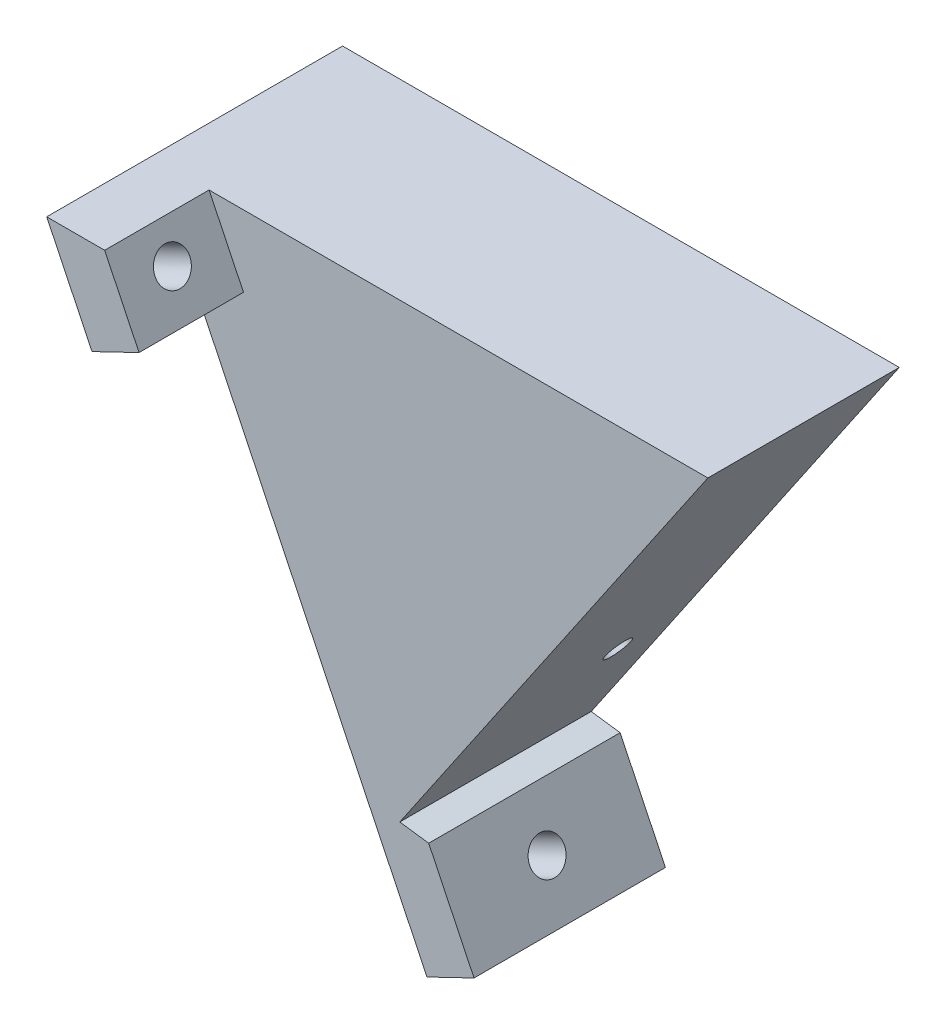
ISO-10303-21;
HEADER;
FILE_DESCRIPTION(('STEP AP214'),'2;1');
FILE_NAME('part.step','',(''),(''),'','','');
FILE_SCHEMA(('AUTOMOTIVE_DESIGN { 1 0 10303 214 1 1 1 1 }'));
ENDSEC;
DATA;
#1=APPLICATION_CONTEXT('core data for automotive mechanical design processes');
#2=APPLICATION_PROTOCOL_DEFINITION('international standard','automotive_design',2000,#1);
#3=PRODUCT_CONTEXT('',#1,'mechanical');
#4=PRODUCT('Part','Part','',(#3));
#5=PRODUCT_RELATED_PRODUCT_CATEGORY('part','',(#4));
#6=PRODUCT_DEFINITION_FORMATION('','',#4);
#7=PRODUCT_DEFINITION_CONTEXT('part definition',#1,'design');
#8=PRODUCT_DEFINITION('design','',#6,#7);
#9=PRODUCT_DEFINITION_SHAPE('','',#8);
#10=(LENGTH_UNIT() NAMED_UNIT(*) SI_UNIT(.MILLI.,.METRE.));
#11=(NAMED_UNIT(*) PLANE_ANGLE_UNIT() SI_UNIT($,.RADIAN.));
#12=(NAMED_UNIT(*) SI_UNIT($,.STERADIAN.) SOLID_ANGLE_UNIT());
#13=UNCERTAINTY_MEASURE_WITH_UNIT(LENGTH_MEASURE(1.E-05),#10,'distance_accuracy_value','');
#14=(GEOMETRIC_REPRESENTATION_CONTEXT(3) GLOBAL_UNCERTAINTY_ASSIGNED_CONTEXT((#13)) GLOBAL_UNIT_ASSIGNED_CONTEXT((#10,
#11,#12)) REPRESENTATION_CONTEXT('',''));
#15=CARTESIAN_POINT('',(0.,0.,0.));
#16=DIRECTION('',(0.,0.,1.));
#17=DIRECTION('',(1.,0.,0.));
#18=AXIS2_PLACEMENT_3D('',#15,#16,#17);
#19=CARTESIAN_POINT('',(0.,0.,22.));
#20=DIRECTION('',(0.,0.,1.));
#21=DIRECTION('',(1.,0.,0.));
#22=AXIS2_PLACEMENT_3D('',#19,#20,#21);
#23=PLANE('',#22);
#24=DIRECTION('',(-1.,0.,0.));
#25=VECTOR('',#24,1.);
#26=CARTESIAN_POINT('',(27.7445797660574,24.241346542851,22.));
#27=LINE('',#26,#25);
#28=CARTESIAN_POINT('',(27.7445797660574,24.241346542851,22.));
#29=VERTEX_POINT('',#28);
#30=CARTESIAN_POINT('',(-29.578701160511,24.241346542851,22.));
#31=VERTEX_POINT('',#30);
#32=EDGE_CURVE('E111',#29,#31,#27,.T.);
#33=ORIENTED_EDGE('',*,*,#32,.T.);
#34=DIRECTION('',(0.434007039127834,-0.900909479352665,0.));
#35=VECTOR('',#34,1.);
#36=CARTESIAN_POINT('',(-30.8331808679364,26.8453887776181,22.));
#37=LINE('',#36,#35);
#38=CARTESIAN_POINT('',(-25.6250963984024,16.0344750253861,22.));
#39=VERTEX_POINT('',#38);
#40=EDGE_CURVE('E117',#31,#39,#37,.T.);
#41=ORIENTED_EDGE('',*,*,#40,.T.);
#42=DIRECTION('',(-0.900909479352665,-0.434007039127834,0.));
#43=VECTOR('',#42,1.);
#44=CARTESIAN_POINT('',(-25.6250963984024,16.0344750253861,22.));
#45=LINE('',#44,#43);
#46=CARTESIAN_POINT('',(-31.0305532745184,13.4304327906191,22.));
#47=VERTEX_POINT('',#46);
#48=EDGE_CURVE('E137',#39,#47,#45,.T.);
#49=ORIENTED_EDGE('',*,*,#48,.T.);
#50=DIRECTION('',(0.434007039127834,-0.900909479352665,0.));
#51=VECTOR('',#50,1.);
#52=CARTESIAN_POINT('',(-36.2386377440524,24.241346542851,22.));
#53=LINE('',#52,#51);
#54=CARTESIAN_POINT('',(-4.53467583166741,-41.5695672093809,22.));
#55=VERTEX_POINT('',#54);
#56=EDGE_CURVE('E130',#47,#55,#53,.T.);
#57=ORIENTED_EDGE('',*,*,#56,.T.);
#58=DIRECTION('',(-0.900909479352665,-0.434007039127834,0.));
#59=VECTOR('',#58,1.);
#60=CARTESIAN_POINT('',(0.870781044448587,-38.9655249746139,22.));
#61=LINE('',#60,#59);
#62=CARTESIAN_POINT('',(0.870781044448587,-38.9655249746139,22.));
#63=VERTEX_POINT('',#62);
#64=EDGE_CURVE('E187',#63,#55,#61,.T.);
#65=ORIENTED_EDGE('',*,*,#64,.F.);
#66=DIRECTION('',(-0.434007039127834,0.900909479352665,0.));
#67=VECTOR('',#66,1.);
#68=CARTESIAN_POINT('',(-4.33730342508542,-28.154611222382,22.));
#69=LINE('',#68,#67);
#70=CARTESIAN_POINT('',(-4.33730342508542,-28.154611222382,22.));
#71=VERTEX_POINT('',#70);
#72=EDGE_CURVE('E181',#63,#71,#69,.T.);
#73=ORIENTED_EDGE('',*,*,#72,.T.);
#74=DIRECTION('',(0.990969781140125,-0.134085393936451,0.));
#75=VECTOR('',#74,1.);
#76=CARTESIAN_POINT('',(-4.33730342508542,-28.154611222382,22.));
#77=LINE('',#76,#75);
#78=CARTESIAN_POINT('',(-7.66132268298971,-27.7048473242986,22.));
#79=VERTEX_POINT('',#78);
#80=EDGE_CURVE('E193',#79,#71,#77,.T.);
#81=ORIENTED_EDGE('',*,*,#80,.F.);
#82=DIRECTION('',(0.563206976065699,0.826315860982307,0.));
#83=VECTOR('',#82,1.);
#84=CARTESIAN_POINT('',(-9.74276030120141,-30.758653457149,22.));
#85=LINE('',#84,#83);
#86=EDGE_CURVE('E128',#79,#29,#85,.T.);
#87=ORIENTED_EDGE('',*,*,#86,.T.);
#88=EDGE_LOOP('',(#33,#41,#49,#57,#65,#73,#81,#87));
#89=FACE_BOUND('',#88,.T.);
#90=ADVANCED_FACE('F33',(#89),#23,.T.);
#91=CARTESIAN_POINT('',(27.7445797660574,24.241346542851,22.));
#92=DIRECTION('',(0.,-1.,0.));
#93=DIRECTION('',(0.,0.,-1.));
#94=AXIS2_PLACEMENT_3D('',#91,#92,#93);
#95=PLANE('',#94);
#96=DIRECTION('',(-1.,0.,0.));
#97=VECTOR('',#96,1.);
#98=CARTESIAN_POINT('',(27.7445797660574,24.241346542851,0.));
#99=LINE('',#98,#97);
#100=CARTESIAN_POINT('',(27.7445797660574,24.241346542851,0.));
#101=VERTEX_POINT('',#100);
#102=CARTESIAN_POINT('',(-36.2386377440524,24.241346542851,0.));
#103=VERTEX_POINT('',#102);
#104=EDGE_CURVE('E142',#101,#103,#99,.T.);
#105=ORIENTED_EDGE('',*,*,#104,.T.);
#106=DIRECTION('',(0.,0.,-1.));
#107=VECTOR('',#106,1.);
#108=CARTESIAN_POINT('',(-36.2386377440524,24.241346542851,22.));
#109=LINE('',#108,#107);
#110=CARTESIAN_POINT('',(-36.2386377440524,24.241346542851,34.));
#111=VERTEX_POINT('',#110);
#112=EDGE_CURVE('E124',#111,#103,#109,.T.);
#113=ORIENTED_EDGE('',*,*,#112,.F.);
#114=DIRECTION('',(1.,0.,0.));
#115=VECTOR('',#114,1.);
#116=CARTESIAN_POINT('',(-30.8331808679364,24.241346542851,34.));
#117=LINE('',#116,#115);
#118=CARTESIAN_POINT('',(-29.578701160511,24.241346542851,34.));
#119=VERTEX_POINT('',#118);
#120=EDGE_CURVE('E47',#111,#119,#117,.T.);
#121=ORIENTED_EDGE('',*,*,#120,.T.);
#122=DIRECTION('',(0.,0.,-1.));
#123=VECTOR('',#122,1.);
#124=CARTESIAN_POINT('',(-29.578701160511,24.241346542851,0.));
#125=LINE('',#124,#123);
#126=EDGE_CURVE('E11',#119,#31,#125,.T.);
#127=ORIENTED_EDGE('',*,*,#126,.T.);
#128=ORIENTED_EDGE('',*,*,#32,.F.);
#129=DIRECTION('',(0.,0.,-1.));
#130=VECTOR('',#129,1.);
#131=CARTESIAN_POINT('',(27.7445797660574,24.241346542851,22.));
#132=LINE('',#131,#130);
#133=EDGE_CURVE('E141',#29,#101,#132,.T.);
#134=ORIENTED_EDGE('',*,*,#133,.T.);
#135=EDGE_LOOP('',(#105,#113,#121,#127,#128,#134));
#136=FACE_BOUND('',#135,.T.);
#137=ADVANCED_FACE('F35',(#136),#95,.F.);
#138=CARTESIAN_POINT('',(-36.2386377440524,24.241346542851,22.));
#139=DIRECTION('',(0.900909479352666,0.434007039127834,0.));
#140=DIRECTION('',(-0.434007039127834,0.900909479352666,0.));
#141=AXIS2_PLACEMENT_3D('',#138,#139,#140);
#142=PLANE('',#141);
#143=DIRECTION('',(0.,0.,-1.));
#144=VECTOR('',#143,1.);
#145=CARTESIAN_POINT('',(-27.7840941238881,6.69145033307294,22.));
#146=LINE('',#145,#144);
#147=CARTESIAN_POINT('',(-27.7840941238881,6.69145033307294,8.2837399816851));
#148=VERTEX_POINT('',#147);
#149=CARTESIAN_POINT('',(-27.7840941238881,6.69145033307294,5.7162600183149));
#150=VERTEX_POINT('',#149);
#151=EDGE_CURVE('E41',#148,#150,#146,.T.);
#152=ORIENTED_EDGE('',*,*,#151,.F.);
#153=CARTESIAN_POINT('',(-28.4575811287251,8.08947103821584,7.));
#154=DIRECTION('',(0.900909479352666,0.434007039127834,0.));
#155=DIRECTION('',(0.434007039127834,-0.900909479352666,0.));
#156=AXIS2_PLACEMENT_3D('',#153,#154,#155);
#157=ELLIPSE('',#156,2.99999999999998,1.5);
#158=EDGE_CURVE('E154',#148,#150,#157,.T.);
#159=ORIENTED_EDGE('',*,*,#158,.T.);
#160=EDGE_LOOP('',(#152,#159));
#161=FACE_BOUND('',#160,.T.);
#162=CARTESIAN_POINT('',(-33.2005884701575,17.9349801873824,28.));
#163=DIRECTION('',(0.900909479352665,0.434007039127834,0.));
#164=DIRECTION('',(-0.434007039127834,0.900909479352665,0.));
#165=AXIS2_PLACEMENT_3D('',#162,#163,#164);
#166=CIRCLE('',#165,2.);
#167=CARTESIAN_POINT('',(-34.0686025484132,19.7367991460877,28.));
#168=VERTEX_POINT('',#167);
#169=EDGE_CURVE('E166',#168,#168,#166,.T.);
#170=ORIENTED_EDGE('',*,*,#169,.T.);
#171=EDGE_LOOP('',(#170));
#172=FACE_BOUND('',#171,.T.);
#173=CARTESIAN_POINT('',(-7.13871806643441,-36.164110333265,11.));
#174=DIRECTION('',(0.900909479352665,0.434007039127834,0.));
#175=DIRECTION('',(-0.434007039127834,0.900909479352665,0.));
#176=AXIS2_PLACEMENT_3D('',#173,#174,#175);
#177=CIRCLE('',#176,2.);
#178=CARTESIAN_POINT('',(-8.00673214469008,-34.3622913745596,11.));
#179=VERTEX_POINT('',#178);
#180=EDGE_CURVE('E162',#179,#179,#177,.T.);
#181=ORIENTED_EDGE('',*,*,#180,.T.);
#182=EDGE_LOOP('',(#181));
#183=FACE_BOUND('',#182,.T.);
#184=DIRECTION('',(0.434007039127834,-0.900909479352665,0.));
#185=VECTOR('',#184,1.);
#186=CARTESIAN_POINT('',(-36.2386377440524,24.241346542851,0.));
#187=LINE('',#186,#185);
#188=CARTESIAN_POINT('',(-4.53467583166741,-41.5695672093809,0.));
#189=VERTEX_POINT('',#188);
#190=EDGE_CURVE('E134',#103,#189,#187,.T.);
#191=ORIENTED_EDGE('',*,*,#190,.T.);
#192=DIRECTION('',(0.,0.,1.));
#193=VECTOR('',#192,1.);
#194=CARTESIAN_POINT('',(-4.53467583166741,-41.5695672093809,0.));
#195=LINE('',#194,#193);
#196=EDGE_CURVE('E169',#189,#55,#195,.T.);
#197=ORIENTED_EDGE('',*,*,#196,.T.);
#198=ORIENTED_EDGE('',*,*,#56,.F.);
#199=DIRECTION('',(0.,0.,1.));
#200=VECTOR('',#199,1.);
#201=CARTESIAN_POINT('',(-31.0305532745184,13.4304327906191,34.));
#202=LINE('',#201,#200);
#203=CARTESIAN_POINT('',(-31.0305532745184,13.4304327906191,34.));
#204=VERTEX_POINT('',#203);
#205=EDGE_CURVE('E204',#47,#204,#202,.T.);
#206=ORIENTED_EDGE('',*,*,#205,.T.);
#207=DIRECTION('',(-0.434007039127834,0.900909479352665,0.));
#208=VECTOR('',#207,1.);
#209=CARTESIAN_POINT('',(-36.2386377440524,24.241346542851,34.));
#210=LINE('',#209,#208);
#211=EDGE_CURVE('E200',#204,#111,#210,.T.);
#212=ORIENTED_EDGE('',*,*,#211,.T.);
#213=ORIENTED_EDGE('',*,*,#112,.T.);
#214=EDGE_LOOP('',(#191,#197,#198,#206,#212,#213));
#215=FACE_BOUND('',#214,.T.);
#216=ADVANCED_FACE('F157',(#161,#172,#183,#215),#142,.F.);
#217=CARTESIAN_POINT('',(-9.74276030120141,-30.758653457149,22.));
#218=DIRECTION('',(-0.826315860982307,0.563206976065699,0.));
#219=DIRECTION('',(-0.563206976065699,-0.826315860982307,0.));
#220=AXIS2_PLACEMENT_3D('',#217,#218,#219);
#221=PLANE('',#220);
#222=CARTESIAN_POINT('',(2.40026584310091,-12.9428672013528,7.));
#223=DIRECTION('',(0.826315860982307,-0.563206976065699,0.));
#224=DIRECTION('',(0.563206976065699,0.826315860982307,0.));
#225=AXIS2_PLACEMENT_3D('',#222,#223,#224);
#226=CIRCLE('',#225,1.5);
#227=CARTESIAN_POINT('',(3.24507630719946,-11.7033934098793,7.));
#228=VERTEX_POINT('',#227);
#229=EDGE_CURVE('E155',#228,#228,#226,.T.);
#230=ORIENTED_EDGE('',*,*,#229,.F.);
#231=EDGE_LOOP('',(#230));
#232=FACE_BOUND('',#231,.T.);
#233=ORIENTED_EDGE('',*,*,#86,.F.);
#234=DIRECTION('',(0.,0.,-1.));
#235=VECTOR('',#234,1.);
#236=CARTESIAN_POINT('',(-7.66132268298971,-27.7048473242986,22.));
#237=LINE('',#236,#235);
#238=CARTESIAN_POINT('',(-7.66132268298971,-27.7048473242986,0.));
#239=VERTEX_POINT('',#238);
#240=EDGE_CURVE('E195',#79,#239,#237,.T.);
#241=ORIENTED_EDGE('',*,*,#240,.T.);
#242=DIRECTION('',(0.563206976065699,0.826315860982307,0.));
#243=VECTOR('',#242,1.);
#244=CARTESIAN_POINT('',(-9.74276030120141,-30.758653457149,0.));
#245=LINE('',#244,#243);
#246=EDGE_CURVE('E131',#239,#101,#245,.T.);
#247=ORIENTED_EDGE('',*,*,#246,.T.);
#248=ORIENTED_EDGE('',*,*,#133,.F.);
#249=EDGE_LOOP('',(#233,#241,#247,#248));
#250=FACE_BOUND('',#249,.T.);
#251=ADVANCED_FACE('F230',(#232,#250),#221,.F.);
#252=CARTESIAN_POINT('',(0.,0.,0.));
#253=DIRECTION('',(0.,0.,1.));
#254=DIRECTION('',(1.,0.,0.));
#255=AXIS2_PLACEMENT_3D('',#252,#253,#254);
#256=PLANE('',#255);
#257=ORIENTED_EDGE('',*,*,#104,.F.);
#258=ORIENTED_EDGE('',*,*,#246,.F.);
#259=DIRECTION('',(0.990969781140125,-0.134085393936451,0.));
#260=VECTOR('',#259,1.);
#261=CARTESIAN_POINT('',(-4.33730342508542,-28.154611222382,0.));
#262=LINE('',#261,#260);
#263=CARTESIAN_POINT('',(-4.33730342508542,-28.154611222382,0.));
#264=VERTEX_POINT('',#263);
#265=EDGE_CURVE('E190',#239,#264,#262,.T.);
#266=ORIENTED_EDGE('',*,*,#265,.T.);
#267=DIRECTION('',(0.434007039127834,-0.900909479352665,0.));
#268=VECTOR('',#267,1.);
#269=CARTESIAN_POINT('',(-4.33730342508542,-28.154611222382,0.));
#270=LINE('',#269,#268);
#271=CARTESIAN_POINT('',(0.870781044448587,-38.9655249746139,0.));
#272=VERTEX_POINT('',#271);
#273=EDGE_CURVE('E175',#264,#272,#270,.T.);
#274=ORIENTED_EDGE('',*,*,#273,.T.);
#275=DIRECTION('',(-0.900909479352665,-0.434007039127834,0.));
#276=VECTOR('',#275,1.);
#277=CARTESIAN_POINT('',(0.870781044448587,-38.9655249746139,0.));
#278=LINE('',#277,#276);
#279=EDGE_CURVE('E184',#272,#189,#278,.T.);
#280=ORIENTED_EDGE('',*,*,#279,.T.);
#281=ORIENTED_EDGE('',*,*,#190,.F.);
#282=EDGE_LOOP('',(#257,#258,#266,#274,#280,#281));
#283=FACE_BOUND('',#282,.T.);
#284=ADVANCED_FACE('F228',(#283),#256,.F.);
#285=CARTESIAN_POINT('',(-30.8331808679364,26.8453887776181,34.));
#286=DIRECTION('',(0.,0.,1.));
#287=DIRECTION('',(1.,0.,0.));
#288=AXIS2_PLACEMENT_3D('',#285,#286,#287);
#289=PLANE('',#288);
#290=ORIENTED_EDGE('',*,*,#120,.F.);
#291=ORIENTED_EDGE('',*,*,#211,.F.);
#292=DIRECTION('',(-0.900909479352665,-0.434007039127834,0.));
#293=VECTOR('',#292,1.);
#294=CARTESIAN_POINT('',(-25.6250963984024,16.0344750253861,34.));
#295=LINE('',#294,#293);
#296=CARTESIAN_POINT('',(-25.6250963984024,16.0344750253861,34.));
#297=VERTEX_POINT('',#296);
#298=EDGE_CURVE('E144',#297,#204,#295,.T.);
#299=ORIENTED_EDGE('',*,*,#298,.F.);
#300=DIRECTION('',(-0.434007039127834,0.900909479352665,0.));
#301=VECTOR('',#300,1.);
#302=CARTESIAN_POINT('',(-30.8331808679364,26.8453887776181,34.));
#303=LINE('',#302,#301);
#304=EDGE_CURVE('E203',#297,#119,#303,.T.);
#305=ORIENTED_EDGE('',*,*,#304,.T.);
#306=EDGE_LOOP('',(#290,#291,#299,#305));
#307=FACE_BOUND('',#306,.T.);
#308=ADVANCED_FACE('F232',(#307),#289,.T.);
#309=CARTESIAN_POINT('',(-25.6250963984024,16.0344750253861,34.));
#310=DIRECTION('',(0.434007039127834,-0.900909479352665,0.));
#311=DIRECTION('',(0.900909479352665,0.434007039127834,0.));
#312=AXIS2_PLACEMENT_3D('',#309,#310,#311);
#313=PLANE('',#312);
#314=ORIENTED_EDGE('',*,*,#205,.F.);
#315=ORIENTED_EDGE('',*,*,#48,.F.);
#316=DIRECTION('',(0.,0.,1.));
#317=VECTOR('',#316,1.);
#318=CARTESIAN_POINT('',(-25.6250963984024,16.0344750253861,34.));
#319=LINE('',#318,#317);
#320=EDGE_CURVE('E121',#39,#297,#319,.T.);
#321=ORIENTED_EDGE('',*,*,#320,.T.);
#322=ORIENTED_EDGE('',*,*,#298,.T.);
#323=EDGE_LOOP('',(#314,#315,#321,#322));
#324=FACE_BOUND('',#323,.T.);
#325=ADVANCED_FACE('F253',(#324),#313,.T.);
#326=CARTESIAN_POINT('',(-14.5288025097088,-6.99915219433874,0.));
#327=DIRECTION('',(0.900909479352665,0.434007039127834,0.));
#328=DIRECTION('',(-0.434007039127834,0.900909479352665,0.));
#329=AXIS2_PLACEMENT_3D('',#326,#327,#328);
#330=PLANE('',#329);
#331=ORIENTED_EDGE('',*,*,#126,.F.);
#332=ORIENTED_EDGE('',*,*,#304,.F.);
#333=ORIENTED_EDGE('',*,*,#320,.F.);
#334=ORIENTED_EDGE('',*,*,#40,.F.);
#335=EDGE_LOOP('',(#331,#332,#333,#334));
#336=FACE_BOUND('',#335,.T.);
#337=CARTESIAN_POINT('',(-27.7951315940415,20.5390224221494,28.));
#338=DIRECTION('',(0.900909479352665,0.434007039127834,0.));
#339=DIRECTION('',(-0.434007039127834,0.900909479352665,0.));
#340=AXIS2_PLACEMENT_3D('',#337,#338,#339);
#341=CIRCLE('',#340,2.);
#342=CARTESIAN_POINT('',(-28.6631456722972,22.3408413808547,28.));
#343=VERTEX_POINT('',#342);
#344=EDGE_CURVE('E170',#343,#343,#341,.T.);
#345=ORIENTED_EDGE('',*,*,#344,.F.);
#346=EDGE_LOOP('',(#345));
#347=FACE_BOUND('',#346,.T.);
#348=ADVANCED_FACE('F118',(#336,#347),#330,.T.);
#349=CARTESIAN_POINT('',(-4.33730342508542,-28.154611222382,22.));
#350=DIRECTION('',(0.134085393936451,0.990969781140125,0.));
#351=DIRECTION('',(-0.990969781140125,0.134085393936451,0.));
#352=AXIS2_PLACEMENT_3D('',#349,#350,#351);
#353=PLANE('',#352);
#354=ORIENTED_EDGE('',*,*,#265,.F.);
#355=ORIENTED_EDGE('',*,*,#240,.F.);
#356=ORIENTED_EDGE('',*,*,#80,.T.);
#357=DIRECTION('',(0.,0.,-1.));
#358=VECTOR('',#357,1.);
#359=CARTESIAN_POINT('',(-4.33730342508542,-28.154611222382,22.));
#360=LINE('',#359,#358);
#361=EDGE_CURVE('E198',#71,#264,#360,.T.);
#362=ORIENTED_EDGE('',*,*,#361,.T.);
#363=EDGE_LOOP('',(#354,#355,#356,#362));
#364=FACE_BOUND('',#363,.T.);
#365=ADVANCED_FACE('F224',(#364),#353,.T.);
#366=CARTESIAN_POINT('',(0.870781044448587,-38.9655249746139,0.));
#367=DIRECTION('',(0.434007039127834,-0.900909479352665,0.));
#368=DIRECTION('',(0.900909479352665,0.434007039127834,0.));
#369=AXIS2_PLACEMENT_3D('',#366,#367,#368);
#370=PLANE('',#369);
#371=ORIENTED_EDGE('',*,*,#196,.F.);
#372=ORIENTED_EDGE('',*,*,#279,.F.);
#373=DIRECTION('',(0.,0.,1.));
#374=VECTOR('',#373,1.);
#375=CARTESIAN_POINT('',(0.870781044448587,-38.9655249746139,0.));
#376=LINE('',#375,#374);
#377=EDGE_CURVE('E178',#272,#63,#376,.T.);
#378=ORIENTED_EDGE('',*,*,#377,.T.);
#379=ORIENTED_EDGE('',*,*,#64,.T.);
#380=EDGE_LOOP('',(#371,#372,#378,#379));
#381=FACE_BOUND('',#380,.T.);
#382=ADVANCED_FACE('F216',(#381),#370,.T.);
#383=CARTESIAN_POINT('',(-14.5288025097088,-6.99915219433874,0.));
#384=DIRECTION('',(-0.900909479352665,-0.434007039127834,0.));
#385=DIRECTION('',(0.434007039127834,-0.900909479352665,0.));
#386=AXIS2_PLACEMENT_3D('',#383,#384,#385);
#387=PLANE('',#386);
#388=CARTESIAN_POINT('',(-1.73326119031842,-33.560068098498,11.));
#389=DIRECTION('',(0.900909479352665,0.434007039127834,0.));
#390=DIRECTION('',(-0.434007039127834,0.900909479352665,0.));
#391=AXIS2_PLACEMENT_3D('',#388,#389,#390);
#392=CIRCLE('',#391,2.);
#393=CARTESIAN_POINT('',(-2.60127526857409,-31.7582491397926,11.));
#394=VERTEX_POINT('',#393);
#395=EDGE_CURVE('E159',#394,#394,#392,.T.);
#396=ORIENTED_EDGE('',*,*,#395,.F.);
#397=EDGE_LOOP('',(#396));
#398=FACE_BOUND('',#397,.T.);
#399=ORIENTED_EDGE('',*,*,#273,.F.);
#400=ORIENTED_EDGE('',*,*,#361,.F.);
#401=ORIENTED_EDGE('',*,*,#72,.F.);
#402=ORIENTED_EDGE('',*,*,#377,.F.);
#403=EDGE_LOOP('',(#399,#400,#401,#402));
#404=FACE_BOUND('',#403,.T.);
#405=ADVANCED_FACE('F222',(#398,#404),#387,.F.);
#406=CARTESIAN_POINT('',(-7.13871806643441,-36.164110333265,11.));
#407=DIRECTION('',(0.900909479352665,0.434007039127834,0.));
#408=DIRECTION('',(-0.434007039127834,0.900909479352665,0.));
#409=AXIS2_PLACEMENT_3D('',#406,#407,#408);
#410=CYLINDRICAL_SURFACE('',#409,2.);
#411=CARTESIAN_POINT('',(-8.00673214469008,-34.3622913745596,11.));
#412=CARTESIAN_POINT('',(-7.95042530223054,-34.3351659346141,11.));
#413=CARTESIAN_POINT('',(-7.894118459771,-34.3080404946686,11.));
#414=CARTESIAN_POINT('',(-7.78150477485191,-34.2537896147777,11.));
#415=CARTESIAN_POINT('',(-7.72519793239237,-34.2266641748322,11.));
#416=CARTESIAN_POINT('',(-7.61258424747329,-34.1724132949412,11.));
#417=CARTESIAN_POINT('',(-7.55627740501375,-34.1452878549957,11.));
#418=CARTESIAN_POINT('',(-7.44366372009467,-34.0910369751047,11.));
#419=CARTESIAN_POINT('',(-7.38735687763512,-34.0639115351592,11.));
#420=CARTESIAN_POINT('',(-7.27474319271604,-34.0096606552683,11.));
#421=CARTESIAN_POINT('',(-7.2184363502565,-33.9825352153228,11.));
#422=CARTESIAN_POINT('',(-7.10582266533742,-33.9282843354318,11.));
#423=CARTESIAN_POINT('',(-7.04951582287787,-33.9011588954863,11.));
#424=CARTESIAN_POINT('',(-6.93690213795879,-33.8469080155953,11.));
#425=CARTESIAN_POINT('',(-6.88059529549925,-33.8197825756498,11.));
#426=CARTESIAN_POINT('',(-6.76798161058017,-33.7655316957588,11.));
#427=CARTESIAN_POINT('',(-6.71167476812063,-33.7384062558134,11.));
#428=CARTESIAN_POINT('',(-6.59906108320154,-33.6841553759224,11.));
#429=CARTESIAN_POINT('',(-6.542754240742,-33.6570299359769,11.));
#430=CARTESIAN_POINT('',(-6.43014055582292,-33.6027790560859,11.));
#431=CARTESIAN_POINT('',(-6.37383371336337,-33.5756536161404,11.));
#432=CARTESIAN_POINT('',(-6.26122002844429,-33.5214027362494,11.));
#433=CARTESIAN_POINT('',(-6.20491318598475,-33.4942772963039,11.));
#434=CARTESIAN_POINT('',(-6.09229950106567,-33.440026416413,11.));
#435=CARTESIAN_POINT('',(-6.03599265860613,-33.4129009764675,11.));
#436=CARTESIAN_POINT('',(-5.92337897368704,-33.3586500965765,11.));
#437=CARTESIAN_POINT('',(-5.8670721312275,-33.331524656631,11.));
#438=CARTESIAN_POINT('',(-5.75445844630842,-33.27727377674,11.));
#439=CARTESIAN_POINT('',(-5.69815160384888,-33.2501483367946,11.));
#440=CARTESIAN_POINT('',(-5.58553791892979,-33.1958974569036,11.));
#441=CARTESIAN_POINT('',(-5.52923107647025,-33.1687720169581,11.));
#442=CARTESIAN_POINT('',(-5.41661739155117,-33.1145211370671,11.));
#443=CARTESIAN_POINT('',(-5.36031054909163,-33.0873956971216,11.));
#444=CARTESIAN_POINT('',(-5.24769686417254,-33.0331448172306,11.));
#445=CARTESIAN_POINT('',(-5.191390021713,-33.0060193772851,11.));
#446=CARTESIAN_POINT('',(-5.07877633679392,-32.9517684973942,11.));
#447=CARTESIAN_POINT('',(-5.02246949433438,-32.9246430574487,11.));
#448=CARTESIAN_POINT('',(-4.90985580941529,-32.8703921775577,11.));
#449=CARTESIAN_POINT('',(-4.85354896695575,-32.8432667376122,11.));
#450=CARTESIAN_POINT('',(-4.74093528203667,-32.7890158577212,11.));
#451=CARTESIAN_POINT('',(-4.68462843957713,-32.7618904177757,11.));
#452=CARTESIAN_POINT('',(-4.57201475465804,-32.7076395378848,11.));
#453=CARTESIAN_POINT('',(-4.5157079121985,-32.6805140979393,11.));
#454=CARTESIAN_POINT('',(-4.40309422727942,-32.6262632180483,11.));
#455=CARTESIAN_POINT('',(-4.34678738481988,-32.5991377781028,11.));
#456=CARTESIAN_POINT('',(-4.2341736999008,-32.5448868982118,11.));
#457=CARTESIAN_POINT('',(-4.17786685744125,-32.5177614582663,11.));
#458=CARTESIAN_POINT('',(-4.06525317252217,-32.4635105783753,11.));
#459=CARTESIAN_POINT('',(-4.00894633006263,-32.4363851384299,11.));
#460=CARTESIAN_POINT('',(-3.89633264514355,-32.3821342585389,11.));
#461=CARTESIAN_POINT('',(-3.840025802684,-32.3550088185934,11.));
#462=CARTESIAN_POINT('',(-3.72741211776492,-32.3007579387024,11.));
#463=CARTESIAN_POINT('',(-3.67110527530538,-32.2736324987569,11.));
#464=CARTESIAN_POINT('',(-3.5584915903863,-32.2193816188659,11.));
#465=CARTESIAN_POINT('',(-3.50218474792675,-32.1922561789205,11.));
#466=CARTESIAN_POINT('',(-3.38957106300767,-32.1380052990295,11.));
#467=CARTESIAN_POINT('',(-3.33326422054813,-32.110879859084,11.));
#468=CARTESIAN_POINT('',(-3.22065053562905,-32.056628979193,11.));
#469=CARTESIAN_POINT('',(-3.1643436931695,-32.0295035392475,11.));
#470=CARTESIAN_POINT('',(-3.05173000825042,-31.9752526593565,11.));
#471=CARTESIAN_POINT('',(-2.99542316579088,-31.948127219411,11.));
#472=CARTESIAN_POINT('',(-2.8828094808718,-31.8938763395201,11.));
#473=CARTESIAN_POINT('',(-2.82650263841226,-31.8667508995746,11.));
#474=CARTESIAN_POINT('',(-2.71388895349317,-31.8125000196836,11.));
#475=CARTESIAN_POINT('',(-2.65758211103363,-31.7853745797381,11.));
#476=CARTESIAN_POINT('',(-2.60127526857409,-31.7582491397926,11.));
#477=B_SPLINE_CURVE_WITH_KNOTS('',3,(#411,#412,#413,#414,#415,#416,#417,#418,#419,#420,#421,
#422,#423,#424,#425,#426,#427,#428,#429,#430,#431,#432,#433,#434,#435,#436,#437,#438,#439,#440,
#441,#442,#443,#444,#445,#446,#447,#448,#449,#450,#451,#452,#453,#454,#455,#456,#457,#458,#459,
#460,#461,#462,#463,#464,#465,#466,#467,#468,#469,#470,#471,#472,#473,#474,#475,#476),
.UNSPECIFIED.,.F.,.F.,(4,2,2,2,2,2,2,2,2,2,2,2,2,2,2,2,2,2,2,2,2,2,2,2,2,2,2,2,2,2,2,2,4),(0.,
0.187500000000002,0.374999999999999,0.5625,0.750000000000002,0.937499999999999,1.125,1.3125,1.5,
1.6875,1.875,2.0625,2.25,2.4375,2.625,2.8125,3.,3.1875,3.375,3.5625,3.75,3.9375,4.125,4.3125,
4.5,4.6875,4.875,5.0625,5.25,5.4375,5.625,5.8125,6.),.UNSPECIFIED.);
#478=EDGE_CURVE('BSEAM264',#179,#394,#477,.T.);
#479=ORIENTED_EDGE('',*,*,#180,.F.);
#480=ORIENTED_EDGE('',*,*,#395,.T.);
#481=ORIENTED_EDGE('',*,*,#478,.T.);
#482=ORIENTED_EDGE('',*,*,#478,.F.);
#483=EDGE_LOOP('',(#479,#481,#480,#482));
#484=FACE_BOUND('',#483,.T.);
#485=ADVANCED_FACE('F264',(#484),#410,.F.);
#486=CARTESIAN_POINT('',(-33.2005884701575,17.9349801873824,28.));
#487=DIRECTION('',(0.900909479352665,0.434007039127834,0.));
#488=DIRECTION('',(-0.434007039127834,0.900909479352665,0.));
#489=AXIS2_PLACEMENT_3D('',#486,#487,#488);
#490=CYLINDRICAL_SURFACE('',#489,2.);
#491=CARTESIAN_POINT('',(-34.0686025484132,19.7367991460877,28.));
#492=CARTESIAN_POINT('',(-34.0122957059537,19.7639245860332,28.));
#493=CARTESIAN_POINT('',(-33.9559888634941,19.7910500259787,28.));
#494=CARTESIAN_POINT('',(-33.843375178575,19.8453009058697,28.));
#495=CARTESIAN_POINT('',(-33.7870683361155,19.8724263458152,28.));
#496=CARTESIAN_POINT('',(-33.6744546511964,19.9266772257061,28.));
#497=CARTESIAN_POINT('',(-33.6181478087369,19.9538026656516,28.));
#498=CARTESIAN_POINT('',(-33.5055341238178,20.0080535455426,28.));
#499=CARTESIAN_POINT('',(-33.4492272813583,20.0351789854881,28.));
#500=CARTESIAN_POINT('',(-33.3366135964392,20.0894298653791,28.));
#501=CARTESIAN_POINT('',(-33.2803067539796,20.1165553053246,28.));
#502=CARTESIAN_POINT('',(-33.1676930690605,20.1708061852156,28.));
#503=CARTESIAN_POINT('',(-33.111386226601,20.197931625161,28.));
#504=CARTESIAN_POINT('',(-32.9987725416819,20.252182505052,28.));
#505=CARTESIAN_POINT('',(-32.9424656992224,20.2793079449975,28.));
#506=CARTESIAN_POINT('',(-32.8298520143033,20.3335588248885,28.));
#507=CARTESIAN_POINT('',(-32.7735451718438,20.360684264834,28.));
#508=CARTESIAN_POINT('',(-32.6609314869247,20.414935144725,28.));
#509=CARTESIAN_POINT('',(-32.6046246444651,20.4420605846705,28.));
#510=CARTESIAN_POINT('',(-32.4920109595461,20.4963114645614,28.));
#511=CARTESIAN_POINT('',(-32.4357041170865,20.5234369045069,28.));
#512=CARTESIAN_POINT('',(-32.3230904321674,20.5776877843979,28.));
#513=CARTESIAN_POINT('',(-32.2667835897079,20.6048132243434,28.));
#514=CARTESIAN_POINT('',(-32.1541699047888,20.6590641042344,28.));
#515=CARTESIAN_POINT('',(-32.0978630623293,20.6861895441799,28.));
#516=CARTESIAN_POINT('',(-31.9852493774102,20.7404404240708,28.));
#517=CARTESIAN_POINT('',(-31.9289425349506,20.7675658640163,28.));
#518=CARTESIAN_POINT('',(-31.8163288500315,20.8218167439073,28.));
#519=CARTESIAN_POINT('',(-31.760022007572,20.8489421838528,28.));
#520=CARTESIAN_POINT('',(-31.6474083226529,20.9031930637438,28.));
#521=CARTESIAN_POINT('',(-31.5911014801934,20.9303185036893,28.));
#522=CARTESIAN_POINT('',(-31.4784877952743,20.9845693835802,28.));
#523=CARTESIAN_POINT('',(-31.4221809528148,21.0116948235257,28.));
#524=CARTESIAN_POINT('',(-31.3095672678957,21.0659457034167,28.));
#525=CARTESIAN_POINT('',(-31.2532604254361,21.0930711433622,28.));
#526=CARTESIAN_POINT('',(-31.140646740517,21.1473220232532,28.));
#527=CARTESIAN_POINT('',(-31.0843398980575,21.1744474631987,28.));
#528=CARTESIAN_POINT('',(-30.9717262131384,21.2286983430896,28.));
#529=CARTESIAN_POINT('',(-30.9154193706789,21.2558237830351,28.));
#530=CARTESIAN_POINT('',(-30.8028056857598,21.3100746629261,28.));
#531=CARTESIAN_POINT('',(-30.7464988433003,21.3372001028716,28.));
#532=CARTESIAN_POINT('',(-30.6338851583812,21.3914509827626,28.));
#533=CARTESIAN_POINT('',(-30.5775783159216,21.4185764227081,28.));
#534=CARTESIAN_POINT('',(-30.4649646310025,21.4728273025991,28.));
#535=CARTESIAN_POINT('',(-30.408657788543,21.4999527425445,28.));
#536=CARTESIAN_POINT('',(-30.2960441036239,21.5542036224355,28.));
#537=CARTESIAN_POINT('',(-30.2397372611644,21.581329062381,28.));
#538=CARTESIAN_POINT('',(-30.1271235762453,21.635579942272,28.));
#539=CARTESIAN_POINT('',(-30.0708167337858,21.6627053822175,28.));
#540=CARTESIAN_POINT('',(-29.9582030488667,21.7169562621085,28.));
#541=CARTESIAN_POINT('',(-29.9018962064071,21.744081702054,28.));
#542=CARTESIAN_POINT('',(-29.7892825214881,21.7983325819449,28.));
#543=CARTESIAN_POINT('',(-29.7329756790285,21.8254580218904,28.));
#544=CARTESIAN_POINT('',(-29.6203619941094,21.8797089017814,28.));
#545=CARTESIAN_POINT('',(-29.5640551516499,21.9068343417269,28.));
#546=CARTESIAN_POINT('',(-29.4514414667308,21.9610852216179,28.));
#547=CARTESIAN_POINT('',(-29.3951346242713,21.9882106615634,28.));
#548=CARTESIAN_POINT('',(-29.2825209393522,22.0424615414543,28.));
#549=CARTESIAN_POINT('',(-29.2262140968926,22.0695869813998,28.));
#550=CARTESIAN_POINT('',(-29.1136004119736,22.1238378612908,28.));
#551=CARTESIAN_POINT('',(-29.057293569514,22.1509633012363,28.));
#552=CARTESIAN_POINT('',(-28.9446798845949,22.2052141811273,28.));
#553=CARTESIAN_POINT('',(-28.8883730421354,22.2323396210728,28.));
#554=CARTESIAN_POINT('',(-28.7757593572163,22.2865905009637,28.));
#555=CARTESIAN_POINT('',(-28.7194525147568,22.3137159409092,28.));
#556=CARTESIAN_POINT('',(-28.6631456722972,22.3408413808547,28.));
#557=B_SPLINE_CURVE_WITH_KNOTS('',3,(#491,#492,#493,#494,#495,#496,#497,#498,#499,#500,#501,
#502,#503,#504,#505,#506,#507,#508,#509,#510,#511,#512,#513,#514,#515,#516,#517,#518,#519,#520,
#521,#522,#523,#524,#525,#526,#527,#528,#529,#530,#531,#532,#533,#534,#535,#536,#537,#538,#539,
#540,#541,#542,#543,#544,#545,#546,#547,#548,#549,#550,#551,#552,#553,#554,#555,#556),
.UNSPECIFIED.,.F.,.F.,(4,2,2,2,2,2,2,2,2,2,2,2,2,2,2,2,2,2,2,2,2,2,2,2,2,2,2,2,2,2,2,2,4),(0.,
0.187500000000005,0.375000000000003,0.562500000000002,0.750000000000006,0.937500000000005,1.125,
1.3125,1.50000000000001,1.6875,1.875,2.0625,2.25000000000001,2.4375,2.625,2.8125,
3.00000000000001,3.1875,3.375,3.5625,3.75,3.9375,4.125,4.3125,4.5,4.6875,4.875,5.0625,5.25,
5.4375,5.625,5.8125,6.),.UNSPECIFIED.);
#558=EDGE_CURVE('BSEAM268',#168,#343,#557,.T.);
#559=ORIENTED_EDGE('',*,*,#169,.F.);
#560=ORIENTED_EDGE('',*,*,#344,.T.);
#561=ORIENTED_EDGE('',*,*,#558,.T.);
#562=ORIENTED_EDGE('',*,*,#558,.F.);
#563=EDGE_LOOP('',(#559,#561,#560,#562));
#564=FACE_BOUND('',#563,.T.);
#565=ADVANCED_FACE('F268',(#564),#490,.F.);
#566=CARTESIAN_POINT('',(-27.3471051522621,7.33258393701243,7.));
#567=DIRECTION('',(0.826315860982307,-0.563206976065699,0.));
#568=DIRECTION('',(0.563206976065699,0.826315860982307,0.));
#569=AXIS2_PLACEMENT_3D('',#566,#567,#568);
#570=PLANE('',#569);
#571=ORIENTED_EDGE('',*,*,#151,.T.);
#572=CARTESIAN_POINT('',(-27.3471051522621,7.33258393701243,7.));
#573=DIRECTION('',(0.826315860982307,-0.563206976065699,0.));
#574=DIRECTION('',(0.563206976065699,0.826315860982307,0.));
#575=AXIS2_PLACEMENT_3D('',#572,#573,#574);
#576=CIRCLE('',#575,1.5);
#577=EDGE_CURVE('E54',#150,#148,#576,.T.);
#578=ORIENTED_EDGE('',*,*,#577,.T.);
#579=EDGE_LOOP('',(#571,#578));
#580=FACE_BOUND('',#579,.T.);
#581=ADVANCED_FACE('F149',(#580),#570,.T.);
#582=CARTESIAN_POINT('',(-27.3471051522621,7.33258393701243,7.));
#583=DIRECTION('',(0.826315860982307,-0.563206976065699,0.));
#584=DIRECTION('',(0.563206976065699,0.826315860982307,0.));
#585=AXIS2_PLACEMENT_3D('',#582,#583,#584);
#586=CYLINDRICAL_SURFACE('',#585,1.5);
#587=ORIENTED_EDGE('',*,*,#229,.T.);
#588=EDGE_LOOP('',(#587));
#589=FACE_BOUND('',#588,.T.);
#590=ORIENTED_EDGE('',*,*,#577,.F.);
#591=ORIENTED_EDGE('',*,*,#158,.F.);
#592=EDGE_LOOP('',(#590,#591));
#593=FACE_BOUND('',#592,.T.);
#594=ADVANCED_FACE('F153',(#589,#593),#586,.F.);
#595=CLOSED_SHELL('',(#90,#137,#216,#251,#284,#308,#325,#348,#365,#382,#405,#485,#565,#581,#594));
#596=MANIFOLD_SOLID_BREP('B2',#595);
#597=ADVANCED_BREP_SHAPE_REPRESENTATION('',(#18,#596),#14);
#598=SHAPE_DEFINITION_REPRESENTATION(#9,#597);
ENDSEC;
END-ISO-10303-21;
